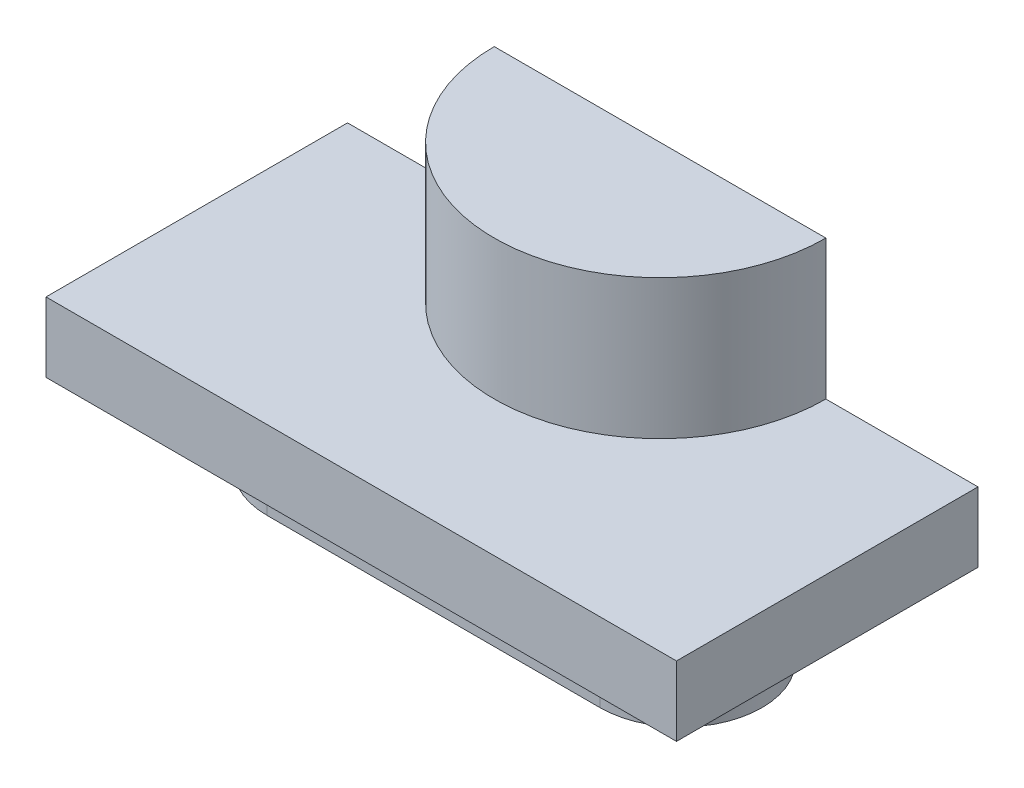
ISO-10303-21;
HEADER;
FILE_DESCRIPTION(('STEP AP214'),'2;1');
FILE_NAME('part.step','',(''),(''),'','','');
FILE_SCHEMA(('AUTOMOTIVE_DESIGN { 1 0 10303 214 1 1 1 1 }'));
ENDSEC;
DATA;
#1=APPLICATION_CONTEXT('core data for automotive mechanical design processes');
#2=APPLICATION_PROTOCOL_DEFINITION('international standard','automotive_design',2000,#1);
#3=PRODUCT_CONTEXT('',#1,'mechanical');
#4=PRODUCT('Part','Part','',(#3));
#5=PRODUCT_RELATED_PRODUCT_CATEGORY('part','',(#4));
#6=PRODUCT_DEFINITION_FORMATION('','',#4);
#7=PRODUCT_DEFINITION_CONTEXT('part definition',#1,'design');
#8=PRODUCT_DEFINITION('design','',#6,#7);
#9=PRODUCT_DEFINITION_SHAPE('','',#8);
#10=(LENGTH_UNIT() NAMED_UNIT(*) SI_UNIT(.MILLI.,.METRE.));
#11=(NAMED_UNIT(*) PLANE_ANGLE_UNIT() SI_UNIT($,.RADIAN.));
#12=(NAMED_UNIT(*) SI_UNIT($,.STERADIAN.) SOLID_ANGLE_UNIT());
#13=UNCERTAINTY_MEASURE_WITH_UNIT(LENGTH_MEASURE(1.E-05),#10,'distance_accuracy_value','');
#14=(GEOMETRIC_REPRESENTATION_CONTEXT(3) GLOBAL_UNCERTAINTY_ASSIGNED_CONTEXT((#13)) GLOBAL_UNIT_ASSIGNED_CONTEXT((#10,
#11,#12)) REPRESENTATION_CONTEXT('',''));
#15=CARTESIAN_POINT('',(0.,0.,0.));
#16=DIRECTION('',(0.,0.,1.));
#17=DIRECTION('',(1.,0.,0.));
#18=AXIS2_PLACEMENT_3D('',#15,#16,#17);
#19=CARTESIAN_POINT('',(0.,10.,0.));
#20=DIRECTION('',(1.,0.,0.));
#21=DIRECTION('',(0.,0.,-1.));
#22=AXIS2_PLACEMENT_3D('',#19,#20,#21);
#23=PLANE('',#22);
#24=DIRECTION('',(0.,0.,1.));
#25=VECTOR('',#24,1.);
#26=CARTESIAN_POINT('',(0.,0.,0.));
#27=LINE('',#26,#25);
#28=CARTESIAN_POINT('',(0.,0.,-43.2551564460636));
#29=VERTEX_POINT('',#28);
#30=CARTESIAN_POINT('',(0.,0.,0.));
#31=VERTEX_POINT('',#30);
#32=EDGE_CURVE('E153',#29,#31,#27,.T.);
#33=ORIENTED_EDGE('',*,*,#32,.T.);
#34=DIRECTION('',(0.,-1.,0.));
#35=VECTOR('',#34,1.);
#36=CARTESIAN_POINT('',(0.,10.,0.));
#37=LINE('',#36,#35);
#38=CARTESIAN_POINT('',(0.,10.,0.));
#39=VERTEX_POINT('',#38);
#40=EDGE_CURVE('E11',#39,#31,#37,.T.);
#41=ORIENTED_EDGE('',*,*,#40,.F.);
#42=DIRECTION('',(0.,0.,1.));
#43=VECTOR('',#42,1.);
#44=CARTESIAN_POINT('',(0.,10.,0.));
#45=LINE('',#44,#43);
#46=CARTESIAN_POINT('',(0.,10.,-43.2551564460636));
#47=VERTEX_POINT('',#46);
#48=EDGE_CURVE('E154',#47,#39,#45,.T.);
#49=ORIENTED_EDGE('',*,*,#48,.F.);
#50=DIRECTION('',(0.,-1.,0.));
#51=VECTOR('',#50,1.);
#52=CARTESIAN_POINT('',(0.,10.,-43.2551564460636));
#53=LINE('',#52,#51);
#54=EDGE_CURVE('E165',#47,#29,#53,.T.);
#55=ORIENTED_EDGE('',*,*,#54,.T.);
#56=EDGE_LOOP('',(#33,#41,#49,#55));
#57=FACE_BOUND('',#56,.T.);
#58=ADVANCED_FACE('F37',(#57),#23,.F.);
#59=CARTESIAN_POINT('',(0.,10.,0.));
#60=DIRECTION('',(0.,0.,-1.));
#61=DIRECTION('',(-1.,0.,0.));
#62=AXIS2_PLACEMENT_3D('',#59,#60,#61);
#63=PLANE('',#62);
#64=DIRECTION('',(1.,0.,0.));
#65=VECTOR('',#64,1.);
#66=CARTESIAN_POINT('',(0.,0.,0.));
#67=LINE('',#66,#65);
#68=CARTESIAN_POINT('',(90.4507412226174,0.,0.));
#69=VERTEX_POINT('',#68);
#70=EDGE_CURVE('E168',#31,#69,#67,.T.);
#71=ORIENTED_EDGE('',*,*,#70,.T.);
#72=DIRECTION('',(0.,-1.,0.));
#73=VECTOR('',#72,1.);
#74=CARTESIAN_POINT('',(90.4507412226174,10.,0.));
#75=LINE('',#74,#73);
#76=CARTESIAN_POINT('',(90.4507412226174,10.,0.));
#77=VERTEX_POINT('',#76);
#78=EDGE_CURVE('E44',#77,#69,#75,.T.);
#79=ORIENTED_EDGE('',*,*,#78,.F.);
#80=DIRECTION('',(1.,0.,0.));
#81=VECTOR('',#80,1.);
#82=CARTESIAN_POINT('',(0.,10.,0.));
#83=LINE('',#82,#81);
#84=EDGE_CURVE('E157',#39,#77,#83,.T.);
#85=ORIENTED_EDGE('',*,*,#84,.F.);
#86=ORIENTED_EDGE('',*,*,#40,.T.);
#87=EDGE_LOOP('',(#71,#79,#85,#86));
#88=FACE_BOUND('',#87,.T.);
#89=ADVANCED_FACE('F215',(#88),#63,.F.);
#90=CARTESIAN_POINT('',(90.4507412226174,10.,0.));
#91=DIRECTION('',(-1.,0.,0.));
#92=DIRECTION('',(0.,0.,1.));
#93=AXIS2_PLACEMENT_3D('',#90,#91,#92);
#94=PLANE('',#93);
#95=DIRECTION('',(0.,0.,-1.));
#96=VECTOR('',#95,1.);
#97=CARTESIAN_POINT('',(90.4507412226174,0.,0.));
#98=LINE('',#97,#96);
#99=CARTESIAN_POINT('',(90.4507412226174,0.,-43.2551564460636));
#100=VERTEX_POINT('',#99);
#101=EDGE_CURVE('E170',#69,#100,#98,.T.);
#102=ORIENTED_EDGE('',*,*,#101,.T.);
#103=DIRECTION('',(0.,-1.,0.));
#104=VECTOR('',#103,1.);
#105=CARTESIAN_POINT('',(90.4507412226174,10.,-43.2551564460636));
#106=LINE('',#105,#104);
#107=CARTESIAN_POINT('',(90.4507412226174,10.,-43.2551564460636));
#108=VERTEX_POINT('',#107);
#109=EDGE_CURVE('E175',#108,#100,#106,.T.);
#110=ORIENTED_EDGE('',*,*,#109,.F.);
#111=DIRECTION('',(0.,0.,-1.));
#112=VECTOR('',#111,1.);
#113=CARTESIAN_POINT('',(90.4507412226174,10.,0.));
#114=LINE('',#113,#112);
#115=EDGE_CURVE('E160',#77,#108,#114,.T.);
#116=ORIENTED_EDGE('',*,*,#115,.F.);
#117=ORIENTED_EDGE('',*,*,#78,.T.);
#118=EDGE_LOOP('',(#102,#110,#116,#117));
#119=FACE_BOUND('',#118,.T.);
#120=ADVANCED_FACE('F182',(#119),#94,.F.);
#121=CARTESIAN_POINT('',(0.,10.,-43.2551564460636));
#122=DIRECTION('',(0.,0.,1.));
#123=DIRECTION('',(1.,0.,0.));
#124=AXIS2_PLACEMENT_3D('',#121,#122,#123);
#125=PLANE('',#124);
#126=DIRECTION('',(-1.,0.,0.));
#127=VECTOR('',#126,1.);
#128=CARTESIAN_POINT('',(0.,0.,-43.2551564460636));
#129=LINE('',#128,#127);
#130=EDGE_CURVE('E158',#100,#29,#129,.T.);
#131=ORIENTED_EDGE('',*,*,#130,.T.);
#132=ORIENTED_EDGE('',*,*,#54,.F.);
#133=DIRECTION('',(-1.,0.,0.));
#134=VECTOR('',#133,1.);
#135=CARTESIAN_POINT('',(0.,10.,-43.2551564460636));
#136=LINE('',#135,#134);
#137=CARTESIAN_POINT('',(21.0473654457759,10.,-43.2551564460636));
#138=VERTEX_POINT('',#137);
#139=EDGE_CURVE('E162',#138,#47,#136,.T.);
#140=ORIENTED_EDGE('',*,*,#139,.F.);
#141=DIRECTION('',(0.,-1.,0.));
#142=VECTOR('',#141,1.);
#143=CARTESIAN_POINT('',(21.0473654457759,30.,-43.2551564460636));
#144=LINE('',#143,#142);
#145=CARTESIAN_POINT('',(21.0473654457759,30.,-43.2551564460636));
#146=VERTEX_POINT('',#145);
#147=EDGE_CURVE('E150',#146,#138,#144,.T.);
#148=ORIENTED_EDGE('',*,*,#147,.F.);
#149=DIRECTION('',(-1.,0.,0.));
#150=VECTOR('',#149,1.);
#151=CARTESIAN_POINT('',(0.,30.,-43.2551564460636));
#152=LINE('',#151,#150);
#153=CARTESIAN_POINT('',(68.6302587875627,30.,-43.2551564460636));
#154=VERTEX_POINT('',#153);
#155=EDGE_CURVE('E137',#154,#146,#152,.T.);
#156=ORIENTED_EDGE('',*,*,#155,.F.);
#157=DIRECTION('',(0.,-1.,0.));
#158=VECTOR('',#157,1.);
#159=CARTESIAN_POINT('',(68.6302587875627,30.,-43.2551564460636));
#160=LINE('',#159,#158);
#161=CARTESIAN_POINT('',(68.6302587875627,10.,-43.2551564460636));
#162=VERTEX_POINT('',#161);
#163=EDGE_CURVE('E146',#154,#162,#160,.T.);
#164=ORIENTED_EDGE('',*,*,#163,.T.);
#165=EDGE_CURVE('E163',#108,#162,#136,.T.);
#166=ORIENTED_EDGE('',*,*,#165,.F.);
#167=ORIENTED_EDGE('',*,*,#109,.T.);
#168=EDGE_LOOP('',(#131,#132,#140,#148,#156,#164,#166,#167));
#169=FACE_BOUND('',#168,.T.);
#170=ADVANCED_FACE('F191',(#169),#125,.F.);
#171=CARTESIAN_POINT('',(0.,10.,0.));
#172=DIRECTION('',(0.,-1.,0.));
#173=DIRECTION('',(0.,0.,-1.));
#174=AXIS2_PLACEMENT_3D('',#171,#172,#173);
#175=PLANE('',#174);
#176=CARTESIAN_POINT('',(44.8388121166693,10.,-43.2551564460636));
#177=DIRECTION('',(0.,1.,0.));
#178=DIRECTION('',(0.,0.,1.));
#179=AXIS2_PLACEMENT_3D('',#176,#177,#178);
#180=CIRCLE('',#179,23.7914466708934);
#181=EDGE_CURVE('E134',#138,#162,#180,.T.);
#182=ORIENTED_EDGE('',*,*,#181,.F.);
#183=ORIENTED_EDGE('',*,*,#139,.T.);
#184=ORIENTED_EDGE('',*,*,#48,.T.);
#185=ORIENTED_EDGE('',*,*,#84,.T.);
#186=ORIENTED_EDGE('',*,*,#115,.T.);
#187=ORIENTED_EDGE('',*,*,#165,.T.);
#188=EDGE_LOOP('',(#182,#183,#184,#185,#186,#187));
#189=FACE_BOUND('',#188,.T.);
#190=ADVANCED_FACE('F198',(#189),#175,.F.);
#191=CARTESIAN_POINT('',(0.,0.,0.));
#192=DIRECTION('',(0.,-1.,0.));
#193=DIRECTION('',(0.,0.,-1.));
#194=AXIS2_PLACEMENT_3D('',#191,#192,#193);
#195=PLANE('',#194);
#196=DIRECTION('',(1.,0.,0.));
#197=VECTOR('',#196,1.);
#198=CARTESIAN_POINT('',(0.,0.,-31.9035915388631));
#199=LINE('',#198,#197);
#200=CARTESIAN_POINT('',(22.9982571695416,0.,-31.9035915388631));
#201=VERTEX_POINT('',#200);
#202=CARTESIAN_POINT('',(70.8026576732841,0.,-31.9035915388631));
#203=VERTEX_POINT('',#202);
#204=EDGE_CURVE('E51',#201,#203,#199,.T.);
#205=ORIENTED_EDGE('',*,*,#204,.F.);
#206=CARTESIAN_POINT('',(22.9982571695416,0.,-20.3068366996803));
#207=DIRECTION('',(0.,-1.,0.));
#208=DIRECTION('',(0.,0.,-1.));
#209=AXIS2_PLACEMENT_3D('',#206,#207,#208);
#210=CIRCLE('',#209,11.5967548391828);
#211=CARTESIAN_POINT('',(22.9982571695416,0.,-8.7100818604975));
#212=VERTEX_POINT('',#211);
#213=EDGE_CURVE('E55',#212,#201,#210,.T.);
#214=ORIENTED_EDGE('',*,*,#213,.F.);
#215=DIRECTION('',(1.,0.,0.));
#216=VECTOR('',#215,1.);
#217=CARTESIAN_POINT('',(0.,0.,-8.7100818604975));
#218=LINE('',#217,#216);
#219=CARTESIAN_POINT('',(70.8026576732841,0.,-8.7100818604975));
#220=VERTEX_POINT('',#219);
#221=EDGE_CURVE('E297',#212,#220,#218,.T.);
#222=ORIENTED_EDGE('',*,*,#221,.T.);
#223=CARTESIAN_POINT('',(70.8026576732841,0.,-20.3068366996803));
#224=DIRECTION('',(0.,-1.,0.));
#225=DIRECTION('',(0.,0.,-1.));
#226=AXIS2_PLACEMENT_3D('',#223,#224,#225);
#227=CIRCLE('',#226,11.5967548391828);
#228=EDGE_CURVE('E303',#203,#220,#227,.T.);
#229=ORIENTED_EDGE('',*,*,#228,.F.);
#230=EDGE_LOOP('',(#205,#214,#222,#229));
#231=FACE_BOUND('',#230,.T.);
#232=ORIENTED_EDGE('',*,*,#32,.F.);
#233=ORIENTED_EDGE('',*,*,#130,.F.);
#234=ORIENTED_EDGE('',*,*,#101,.F.);
#235=ORIENTED_EDGE('',*,*,#70,.F.);
#236=EDGE_LOOP('',(#232,#233,#234,#235));
#237=FACE_BOUND('',#236,.T.);
#238=ADVANCED_FACE('F188',(#231,#237),#195,.T.);
#239=CARTESIAN_POINT('',(44.8388121166693,30.,-43.2551564460636));
#240=DIRECTION('',(0.,-1.,0.));
#241=DIRECTION('',(0.,0.,-1.));
#242=AXIS2_PLACEMENT_3D('',#239,#240,#241);
#243=CYLINDRICAL_SURFACE('',#242,23.7914466708934);
#244=ORIENTED_EDGE('',*,*,#181,.T.);
#245=ORIENTED_EDGE('',*,*,#163,.F.);
#246=CARTESIAN_POINT('',(44.8388121166693,30.,-43.2551564460636));
#247=DIRECTION('',(0.,1.,0.));
#248=DIRECTION('',(0.,0.,1.));
#249=AXIS2_PLACEMENT_3D('',#246,#247,#248);
#250=CIRCLE('',#249,23.7914466708934);
#251=EDGE_CURVE('E145',#146,#154,#250,.T.);
#252=ORIENTED_EDGE('',*,*,#251,.F.);
#253=ORIENTED_EDGE('',*,*,#147,.T.);
#254=EDGE_LOOP('',(#244,#245,#252,#253));
#255=FACE_BOUND('',#254,.T.);
#256=ADVANCED_FACE('F202',(#255),#243,.T.);
#257=CARTESIAN_POINT('',(0.,30.,0.));
#258=DIRECTION('',(0.,1.,0.));
#259=DIRECTION('',(0.,0.,1.));
#260=AXIS2_PLACEMENT_3D('',#257,#258,#259);
#261=PLANE('',#260);
#262=ORIENTED_EDGE('',*,*,#155,.T.);
#263=ORIENTED_EDGE('',*,*,#251,.T.);
#264=EDGE_LOOP('',(#262,#263));
#265=FACE_BOUND('',#264,.T.);
#266=ADVANCED_FACE('F205',(#265),#261,.T.);
#267=CARTESIAN_POINT('',(0.,-10.,-31.9035915388631));
#268=DIRECTION('',(0.,0.,1.));
#269=DIRECTION('',(1.,0.,0.));
#270=AXIS2_PLACEMENT_3D('',#267,#268,#269);
#271=PLANE('',#270);
#272=ORIENTED_EDGE('',*,*,#204,.T.);
#273=DIRECTION('',(0.,1.,0.));
#274=VECTOR('',#273,1.);
#275=CARTESIAN_POINT('',(70.8026576732841,-10.,-31.9035915388631));
#276=LINE('',#275,#274);
#277=CARTESIAN_POINT('',(70.8026576732841,-10.,-31.9035915388631));
#278=VERTEX_POINT('',#277);
#279=EDGE_CURVE('E116',#278,#203,#276,.T.);
#280=ORIENTED_EDGE('',*,*,#279,.F.);
#281=DIRECTION('',(1.,0.,0.));
#282=VECTOR('',#281,1.);
#283=CARTESIAN_POINT('',(0.,-10.,-31.9035915388631));
#284=LINE('',#283,#282);
#285=CARTESIAN_POINT('',(22.9982571695416,-10.,-31.9035915388631));
#286=VERTEX_POINT('',#285);
#287=EDGE_CURVE('E123',#286,#278,#284,.T.);
#288=ORIENTED_EDGE('',*,*,#287,.F.);
#289=DIRECTION('',(0.,1.,0.));
#290=VECTOR('',#289,1.);
#291=CARTESIAN_POINT('',(22.9982571695416,-10.,-31.9035915388631));
#292=LINE('',#291,#290);
#293=EDGE_CURVE('E295',#286,#201,#292,.T.);
#294=ORIENTED_EDGE('',*,*,#293,.T.);
#295=EDGE_LOOP('',(#272,#280,#288,#294));
#296=FACE_BOUND('',#295,.T.);
#297=ADVANCED_FACE('F133',(#296),#271,.F.);
#298=CARTESIAN_POINT('',(70.8026576732841,-10.,-20.3068366996803));
#299=DIRECTION('',(0.,1.,0.));
#300=DIRECTION('',(0.,0.,1.));
#301=AXIS2_PLACEMENT_3D('',#298,#299,#300);
#302=CYLINDRICAL_SURFACE('',#301,11.5967548391828);
#303=ORIENTED_EDGE('',*,*,#228,.T.);
#304=DIRECTION('',(0.,1.,0.));
#305=VECTOR('',#304,1.);
#306=CARTESIAN_POINT('',(70.8026576732841,-10.,-8.7100818604975));
#307=LINE('',#306,#305);
#308=CARTESIAN_POINT('',(70.8026576732841,-10.,-8.7100818604975));
#309=VERTEX_POINT('',#308);
#310=EDGE_CURVE('E118',#309,#220,#307,.T.);
#311=ORIENTED_EDGE('',*,*,#310,.F.);
#312=CARTESIAN_POINT('',(70.8026576732841,-10.,-20.3068366996803));
#313=DIRECTION('',(0.,-1.,0.));
#314=DIRECTION('',(0.,0.,-1.));
#315=AXIS2_PLACEMENT_3D('',#312,#313,#314);
#316=CIRCLE('',#315,11.5967548391828);
#317=EDGE_CURVE('E111',#278,#309,#316,.T.);
#318=ORIENTED_EDGE('',*,*,#317,.F.);
#319=ORIENTED_EDGE('',*,*,#279,.T.);
#320=EDGE_LOOP('',(#303,#311,#318,#319));
#321=FACE_BOUND('',#320,.T.);
#322=ADVANCED_FACE('F114',(#321),#302,.T.);
#323=CARTESIAN_POINT('',(0.,-10.,-8.7100818604975));
#324=DIRECTION('',(0.,0.,1.));
#325=DIRECTION('',(1.,0.,0.));
#326=AXIS2_PLACEMENT_3D('',#323,#324,#325);
#327=PLANE('',#326);
#328=ORIENTED_EDGE('',*,*,#221,.F.);
#329=DIRECTION('',(0.,1.,0.));
#330=VECTOR('',#329,1.);
#331=CARTESIAN_POINT('',(22.9982571695416,-10.,-8.7100818604975));
#332=LINE('',#331,#330);
#333=CARTESIAN_POINT('',(22.9982571695416,-10.,-8.7100818604975));
#334=VERTEX_POINT('',#333);
#335=EDGE_CURVE('E139',#334,#212,#332,.T.);
#336=ORIENTED_EDGE('',*,*,#335,.F.);
#337=DIRECTION('',(1.,0.,0.));
#338=VECTOR('',#337,1.);
#339=CARTESIAN_POINT('',(0.,-10.,-8.7100818604975));
#340=LINE('',#339,#338);
#341=EDGE_CURVE('E122',#334,#309,#340,.T.);
#342=ORIENTED_EDGE('',*,*,#341,.T.);
#343=ORIENTED_EDGE('',*,*,#310,.T.);
#344=EDGE_LOOP('',(#328,#336,#342,#343));
#345=FACE_BOUND('',#344,.T.);
#346=ADVANCED_FACE('F264',(#345),#327,.T.);
#347=CARTESIAN_POINT('',(22.9982571695416,-10.,-20.3068366996803));
#348=DIRECTION('',(0.,1.,0.));
#349=DIRECTION('',(0.,0.,1.));
#350=AXIS2_PLACEMENT_3D('',#347,#348,#349);
#351=CYLINDRICAL_SURFACE('',#350,11.5967548391828);
#352=ORIENTED_EDGE('',*,*,#213,.T.);
#353=ORIENTED_EDGE('',*,*,#293,.F.);
#354=CARTESIAN_POINT('',(22.9982571695416,-10.,-20.3068366996803));
#355=DIRECTION('',(0.,-1.,0.));
#356=DIRECTION('',(0.,0.,-1.));
#357=AXIS2_PLACEMENT_3D('',#354,#355,#356);
#358=CIRCLE('',#357,11.5967548391828);
#359=EDGE_CURVE('E128',#334,#286,#358,.T.);
#360=ORIENTED_EDGE('',*,*,#359,.F.);
#361=ORIENTED_EDGE('',*,*,#335,.T.);
#362=EDGE_LOOP('',(#352,#353,#360,#361));
#363=FACE_BOUND('',#362,.T.);
#364=ADVANCED_FACE('F272',(#363),#351,.T.);
#365=CARTESIAN_POINT('',(0.,-10.,0.));
#366=DIRECTION('',(0.,-1.,0.));
#367=DIRECTION('',(0.,0.,-1.));
#368=AXIS2_PLACEMENT_3D('',#365,#366,#367);
#369=PLANE('',#368);
#370=ORIENTED_EDGE('',*,*,#287,.T.);
#371=ORIENTED_EDGE('',*,*,#317,.T.);
#372=ORIENTED_EDGE('',*,*,#341,.F.);
#373=ORIENTED_EDGE('',*,*,#359,.T.);
#374=EDGE_LOOP('',(#370,#371,#372,#373));
#375=FACE_BOUND('',#374,.T.);
#376=ADVANCED_FACE('F126',(#375),#369,.T.);
#377=CLOSED_SHELL('',(#58,#89,#120,#170,#190,#238,#256,#266,#297,#322,#346,#364,#376));
#378=MANIFOLD_SOLID_BREP('B2',#377);
#379=ADVANCED_BREP_SHAPE_REPRESENTATION('',(#18,#378),#14);
#380=SHAPE_DEFINITION_REPRESENTATION(#9,#379);
ENDSEC;
END-ISO-10303-21;
